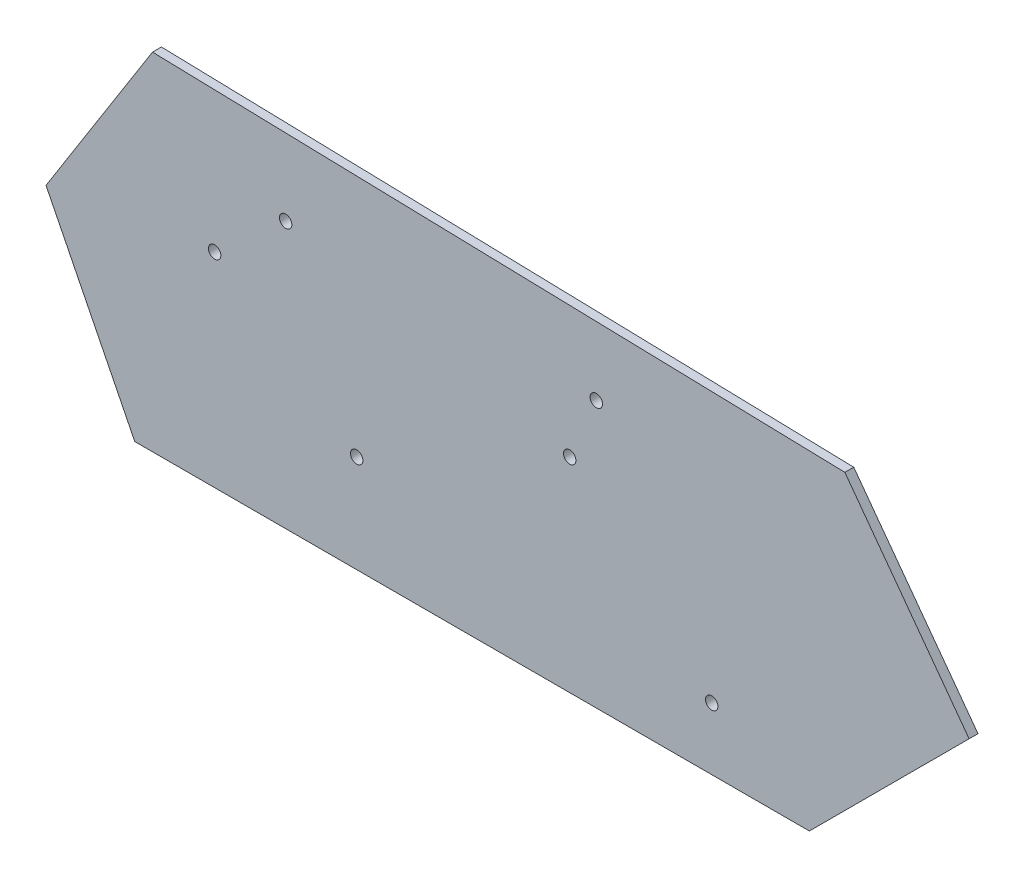
ISO-10303-21;
HEADER;
FILE_DESCRIPTION(('STEP AP214'),'2;1');
FILE_NAME('part.step','',(''),(''),'','','');
FILE_SCHEMA(('AUTOMOTIVE_DESIGN { 1 0 10303 214 1 1 1 1 }'));
ENDSEC;
DATA;
#1=APPLICATION_CONTEXT('core data for automotive mechanical design processes');
#2=APPLICATION_PROTOCOL_DEFINITION('international standard','automotive_design',2000,#1);
#3=PRODUCT_CONTEXT('',#1,'mechanical');
#4=PRODUCT('Part','Part','',(#3));
#5=PRODUCT_RELATED_PRODUCT_CATEGORY('part','',(#4));
#6=PRODUCT_DEFINITION_FORMATION('','',#4);
#7=PRODUCT_DEFINITION_CONTEXT('part definition',#1,'design');
#8=PRODUCT_DEFINITION('design','',#6,#7);
#9=PRODUCT_DEFINITION_SHAPE('','',#8);
#10=(LENGTH_UNIT() NAMED_UNIT(*) SI_UNIT(.MILLI.,.METRE.));
#11=(NAMED_UNIT(*) PLANE_ANGLE_UNIT() SI_UNIT($,.RADIAN.));
#12=(NAMED_UNIT(*) SI_UNIT($,.STERADIAN.) SOLID_ANGLE_UNIT());
#13=UNCERTAINTY_MEASURE_WITH_UNIT(LENGTH_MEASURE(1.E-05),#10,'distance_accuracy_value','');
#14=(GEOMETRIC_REPRESENTATION_CONTEXT(3) GLOBAL_UNCERTAINTY_ASSIGNED_CONTEXT((#13)) GLOBAL_UNIT_ASSIGNED_CONTEXT((#10,
#11,#12)) REPRESENTATION_CONTEXT('',''));
#15=CARTESIAN_POINT('',(0.,0.,0.));
#16=DIRECTION('',(0.,0.,1.));
#17=DIRECTION('',(1.,0.,0.));
#18=AXIS2_PLACEMENT_3D('',#15,#16,#17);
#19=CARTESIAN_POINT('',(0.,0.,5.));
#20=DIRECTION('',(0.,0.,-1.));
#21=DIRECTION('',(-1.,0.,0.));
#22=AXIS2_PLACEMENT_3D('',#19,#20,#21);
#23=PLANE('',#22);
#24=DIRECTION('',(-0.533992991387982,-0.845488903030971,0.));
#25=VECTOR('',#24,1.);
#26=CARTESIAN_POINT('',(-115.,140.,5.));
#27=LINE('',#26,#25);
#28=CARTESIAN_POINT('',(-115.,140.,5.));
#29=VERTEX_POINT('',#28);
#30=CARTESIAN_POINT('',(-175.,45.,5.));
#31=VERTEX_POINT('',#30);
#32=EDGE_CURVE('E137',#29,#31,#27,.T.);
#33=ORIENTED_EDGE('',*,*,#32,.T.);
#34=DIRECTION('',(0.447213595499958,-0.894427190999916,0.));
#35=VECTOR('',#34,1.);
#36=CARTESIAN_POINT('',(-175.,45.,5.));
#37=LINE('',#36,#35);
#38=CARTESIAN_POINT('',(-125.,-55.,5.));
#39=VERTEX_POINT('',#38);
#40=EDGE_CURVE('E92',#31,#39,#37,.T.);
#41=ORIENTED_EDGE('',*,*,#40,.T.);
#42=DIRECTION('',(1.,0.,0.));
#43=VECTOR('',#42,1.);
#44=CARTESIAN_POINT('',(-125.,-55.,5.));
#45=LINE('',#44,#43);
#46=CARTESIAN_POINT('',(255.,-55.,5.));
#47=VERTEX_POINT('',#46);
#48=EDGE_CURVE('E107',#39,#47,#45,.T.);
#49=ORIENTED_EDGE('',*,*,#48,.T.);
#50=DIRECTION('',(0.707106781186546,0.707106781186549,0.));
#51=VECTOR('',#50,1.);
#52=CARTESIAN_POINT('',(255.,-55.,5.));
#53=LINE('',#52,#51);
#54=CARTESIAN_POINT('',(345.,35.0000000000002,5.));
#55=VERTEX_POINT('',#54);
#56=EDGE_CURVE('E105',#47,#55,#53,.T.);
#57=ORIENTED_EDGE('',*,*,#56,.T.);
#58=DIRECTION('',(-0.59319903804985,0.805055837353368,0.));
#59=VECTOR('',#58,1.);
#60=CARTESIAN_POINT('',(345.,35.0000000000002,5.));
#61=LINE('',#60,#59);
#62=CARTESIAN_POINT('',(275.,130.,5.));
#63=VERTEX_POINT('',#62);
#64=EDGE_CURVE('E106',#55,#63,#61,.T.);
#65=ORIENTED_EDGE('',*,*,#64,.T.);
#66=DIRECTION('',(-0.999671430909481,0.0256326007925508,0.));
#67=VECTOR('',#66,1.);
#68=CARTESIAN_POINT('',(275.,130.,5.));
#69=LINE('',#68,#67);
#70=EDGE_CURVE('E59',#63,#29,#69,.T.);
#71=ORIENTED_EDGE('',*,*,#70,.T.);
#72=EDGE_LOOP('',(#33,#41,#49,#57,#65,#71));
#73=FACE_BOUND('',#72,.T.);
#74=CARTESIAN_POINT('',(0.,0.,5.));
#75=DIRECTION('',(0.,0.,1.));
#76=DIRECTION('',(1.,0.,0.));
#77=AXIS2_PLACEMENT_3D('',#74,#75,#76);
#78=CIRCLE('',#77,3.5);
#79=CARTESIAN_POINT('',(3.5,0.,5.));
#80=VERTEX_POINT('',#79);
#81=EDGE_CURVE('E128',#80,#80,#78,.T.);
#82=ORIENTED_EDGE('',*,*,#81,.F.);
#83=EDGE_LOOP('',(#82));
#84=FACE_BOUND('',#83,.T.);
#85=CARTESIAN_POINT('',(-80.,60.,5.));
#86=DIRECTION('',(0.,0.,1.));
#87=DIRECTION('',(1.,0.,0.));
#88=AXIS2_PLACEMENT_3D('',#85,#86,#87);
#89=CIRCLE('',#88,3.50000000000001);
#90=CARTESIAN_POINT('',(-76.5,60.,5.));
#91=VERTEX_POINT('',#90);
#92=EDGE_CURVE('E222',#91,#91,#89,.T.);
#93=ORIENTED_EDGE('',*,*,#92,.F.);
#94=EDGE_LOOP('',(#93));
#95=FACE_BOUND('',#94,.T.);
#96=CARTESIAN_POINT('',(120.,60.,5.));
#97=DIRECTION('',(0.,0.,1.));
#98=DIRECTION('',(1.,0.,0.));
#99=AXIS2_PLACEMENT_3D('',#96,#97,#98);
#100=CIRCLE('',#99,3.50000000000001);
#101=CARTESIAN_POINT('',(123.5,60.,5.));
#102=VERTEX_POINT('',#101);
#103=EDGE_CURVE('E214',#102,#102,#100,.T.);
#104=ORIENTED_EDGE('',*,*,#103,.F.);
#105=EDGE_LOOP('',(#104));
#106=FACE_BOUND('',#105,.T.);
#107=CARTESIAN_POINT('',(200.,-20.,5.));
#108=DIRECTION('',(0.,0.,1.));
#109=DIRECTION('',(1.,0.,0.));
#110=AXIS2_PLACEMENT_3D('',#107,#108,#109);
#111=CIRCLE('',#110,3.49999999999999);
#112=CARTESIAN_POINT('',(203.5,-20.,5.));
#113=VERTEX_POINT('',#112);
#114=EDGE_CURVE('E207',#113,#113,#111,.T.);
#115=ORIENTED_EDGE('',*,*,#114,.F.);
#116=EDGE_LOOP('',(#115));
#117=FACE_BOUND('',#116,.T.);
#118=CARTESIAN_POINT('',(-40.,95.,5.));
#119=DIRECTION('',(0.,0.,1.));
#120=DIRECTION('',(1.,0.,0.));
#121=AXIS2_PLACEMENT_3D('',#118,#119,#120);
#122=CIRCLE('',#121,3.5);
#123=CARTESIAN_POINT('',(-36.5,95.,5.));
#124=VERTEX_POINT('',#123);
#125=EDGE_CURVE('E201',#124,#124,#122,.T.);
#126=ORIENTED_EDGE('',*,*,#125,.F.);
#127=EDGE_LOOP('',(#126));
#128=FACE_BOUND('',#127,.T.);
#129=CARTESIAN_POINT('',(135.,95.,5.));
#130=DIRECTION('',(0.,0.,1.));
#131=DIRECTION('',(1.,0.,0.));
#132=AXIS2_PLACEMENT_3D('',#129,#130,#131);
#133=CIRCLE('',#132,3.49999999999999);
#134=CARTESIAN_POINT('',(138.5,95.,5.));
#135=VERTEX_POINT('',#134);
#136=EDGE_CURVE('E193',#135,#135,#133,.T.);
#137=ORIENTED_EDGE('',*,*,#136,.F.);
#138=EDGE_LOOP('',(#137));
#139=FACE_BOUND('',#138,.T.);
#140=ADVANCED_FACE('F41',(#73,#84,#95,#106,#117,#128,#139),#23,.F.);
#141=CARTESIAN_POINT('',(0.,0.,0.));
#142=DIRECTION('',(0.,0.,-1.));
#143=DIRECTION('',(-1.,0.,0.));
#144=AXIS2_PLACEMENT_3D('',#141,#142,#143);
#145=PLANE('',#144);
#146=CARTESIAN_POINT('',(-40.,95.,0.));
#147=DIRECTION('',(0.,0.,1.));
#148=DIRECTION('',(1.,0.,0.));
#149=AXIS2_PLACEMENT_3D('',#146,#147,#148);
#150=CIRCLE('',#149,3.5);
#151=CARTESIAN_POINT('',(-36.5,95.,0.));
#152=VERTEX_POINT('',#151);
#153=EDGE_CURVE('E199',#152,#152,#150,.T.);
#154=ORIENTED_EDGE('',*,*,#153,.T.);
#155=EDGE_LOOP('',(#154));
#156=FACE_BOUND('',#155,.T.);
#157=CARTESIAN_POINT('',(120.,60.,0.));
#158=DIRECTION('',(0.,0.,1.));
#159=DIRECTION('',(1.,0.,0.));
#160=AXIS2_PLACEMENT_3D('',#157,#158,#159);
#161=CIRCLE('',#160,3.50000000000001);
#162=CARTESIAN_POINT('',(123.5,60.,0.));
#163=VERTEX_POINT('',#162);
#164=EDGE_CURVE('E215',#163,#163,#161,.T.);
#165=ORIENTED_EDGE('',*,*,#164,.T.);
#166=EDGE_LOOP('',(#165));
#167=FACE_BOUND('',#166,.T.);
#168=CARTESIAN_POINT('',(0.,0.,0.));
#169=DIRECTION('',(0.,0.,1.));
#170=DIRECTION('',(1.,0.,0.));
#171=AXIS2_PLACEMENT_3D('',#168,#169,#170);
#172=CIRCLE('',#171,3.5);
#173=CARTESIAN_POINT('',(3.5,0.,0.));
#174=VERTEX_POINT('',#173);
#175=EDGE_CURVE('E221',#174,#174,#172,.T.);
#176=ORIENTED_EDGE('',*,*,#175,.T.);
#177=EDGE_LOOP('',(#176));
#178=FACE_BOUND('',#177,.T.);
#179=DIRECTION('',(-0.533992991387982,-0.845488903030971,0.));
#180=VECTOR('',#179,1.);
#181=CARTESIAN_POINT('',(-115.,140.,0.));
#182=LINE('',#181,#180);
#183=CARTESIAN_POINT('',(-115.,140.,0.));
#184=VERTEX_POINT('',#183);
#185=CARTESIAN_POINT('',(-175.,45.,0.));
#186=VERTEX_POINT('',#185);
#187=EDGE_CURVE('E127',#184,#186,#182,.T.);
#188=ORIENTED_EDGE('',*,*,#187,.F.);
#189=DIRECTION('',(-0.999671430909481,0.0256326007925508,0.));
#190=VECTOR('',#189,1.);
#191=CARTESIAN_POINT('',(275.,130.,0.));
#192=LINE('',#191,#190);
#193=CARTESIAN_POINT('',(275.,130.,0.));
#194=VERTEX_POINT('',#193);
#195=EDGE_CURVE('E87',#194,#184,#192,.T.);
#196=ORIENTED_EDGE('',*,*,#195,.F.);
#197=DIRECTION('',(-0.59319903804985,0.805055837353368,0.));
#198=VECTOR('',#197,1.);
#199=CARTESIAN_POINT('',(345.,35.0000000000002,0.));
#200=LINE('',#199,#198);
#201=CARTESIAN_POINT('',(345.,35.0000000000002,0.));
#202=VERTEX_POINT('',#201);
#203=EDGE_CURVE('E81',#202,#194,#200,.T.);
#204=ORIENTED_EDGE('',*,*,#203,.F.);
#205=DIRECTION('',(0.707106781186546,0.707106781186549,0.));
#206=VECTOR('',#205,1.);
#207=CARTESIAN_POINT('',(255.,-55.,0.));
#208=LINE('',#207,#206);
#209=CARTESIAN_POINT('',(255.,-55.,0.));
#210=VERTEX_POINT('',#209);
#211=EDGE_CURVE('E118',#210,#202,#208,.T.);
#212=ORIENTED_EDGE('',*,*,#211,.F.);
#213=DIRECTION('',(1.,0.,0.));
#214=VECTOR('',#213,1.);
#215=CARTESIAN_POINT('',(-125.,-55.,0.));
#216=LINE('',#215,#214);
#217=CARTESIAN_POINT('',(-125.,-55.,0.));
#218=VERTEX_POINT('',#217);
#219=EDGE_CURVE('E134',#218,#210,#216,.T.);
#220=ORIENTED_EDGE('',*,*,#219,.F.);
#221=DIRECTION('',(0.447213595499958,-0.894427190999916,0.));
#222=VECTOR('',#221,1.);
#223=CARTESIAN_POINT('',(-175.,45.,0.));
#224=LINE('',#223,#222);
#225=EDGE_CURVE('E129',#186,#218,#224,.T.);
#226=ORIENTED_EDGE('',*,*,#225,.F.);
#227=EDGE_LOOP('',(#188,#196,#204,#212,#220,#226));
#228=FACE_BOUND('',#227,.T.);
#229=CARTESIAN_POINT('',(-80.,60.,0.));
#230=DIRECTION('',(0.,0.,1.));
#231=DIRECTION('',(1.,0.,0.));
#232=AXIS2_PLACEMENT_3D('',#229,#230,#231);
#233=CIRCLE('',#232,3.50000000000001);
#234=CARTESIAN_POINT('',(-76.5,60.,0.));
#235=VERTEX_POINT('',#234);
#236=EDGE_CURVE('E217',#235,#235,#233,.T.);
#237=ORIENTED_EDGE('',*,*,#236,.T.);
#238=EDGE_LOOP('',(#237));
#239=FACE_BOUND('',#238,.T.);
#240=CARTESIAN_POINT('',(200.,-20.,0.));
#241=DIRECTION('',(0.,0.,1.));
#242=DIRECTION('',(1.,0.,0.));
#243=AXIS2_PLACEMENT_3D('',#240,#241,#242);
#244=CIRCLE('',#243,3.49999999999999);
#245=CARTESIAN_POINT('',(203.5,-20.,0.));
#246=VERTEX_POINT('',#245);
#247=EDGE_CURVE('E206',#246,#246,#244,.T.);
#248=ORIENTED_EDGE('',*,*,#247,.T.);
#249=EDGE_LOOP('',(#248));
#250=FACE_BOUND('',#249,.T.);
#251=CARTESIAN_POINT('',(135.,95.,0.));
#252=DIRECTION('',(0.,0.,1.));
#253=DIRECTION('',(1.,0.,0.));
#254=AXIS2_PLACEMENT_3D('',#251,#252,#253);
#255=CIRCLE('',#254,3.49999999999999);
#256=CARTESIAN_POINT('',(138.5,95.,0.));
#257=VERTEX_POINT('',#256);
#258=EDGE_CURVE('E197',#257,#257,#255,.T.);
#259=ORIENTED_EDGE('',*,*,#258,.T.);
#260=EDGE_LOOP('',(#259));
#261=FACE_BOUND('',#260,.T.);
#262=ADVANCED_FACE('F148',(#156,#167,#178,#228,#239,#250,#261),#145,.T.);
#263=CARTESIAN_POINT('',(-115.,140.,5.));
#264=DIRECTION('',(0.845488903030971,-0.533992991387982,0.));
#265=DIRECTION('',(0.533992991387982,0.845488903030971,0.));
#266=AXIS2_PLACEMENT_3D('',#263,#264,#265);
#267=PLANE('',#266);
#268=ORIENTED_EDGE('',*,*,#187,.T.);
#269=DIRECTION('',(0.,0.,-1.));
#270=VECTOR('',#269,1.);
#271=CARTESIAN_POINT('',(-175.,45.,5.));
#272=LINE('',#271,#270);
#273=EDGE_CURVE('E11',#31,#186,#272,.T.);
#274=ORIENTED_EDGE('',*,*,#273,.F.);
#275=ORIENTED_EDGE('',*,*,#32,.F.);
#276=DIRECTION('',(0.,0.,-1.));
#277=VECTOR('',#276,1.);
#278=CARTESIAN_POINT('',(-115.,140.,5.));
#279=LINE('',#278,#277);
#280=EDGE_CURVE('E122',#29,#184,#279,.T.);
#281=ORIENTED_EDGE('',*,*,#280,.T.);
#282=EDGE_LOOP('',(#268,#274,#275,#281));
#283=FACE_BOUND('',#282,.T.);
#284=ADVANCED_FACE('F43',(#283),#267,.F.);
#285=CARTESIAN_POINT('',(-175.,45.,5.));
#286=DIRECTION('',(0.894427190999916,0.447213595499958,0.));
#287=DIRECTION('',(-0.447213595499958,0.894427190999916,0.));
#288=AXIS2_PLACEMENT_3D('',#285,#286,#287);
#289=PLANE('',#288);
#290=ORIENTED_EDGE('',*,*,#225,.T.);
#291=DIRECTION('',(0.,0.,-1.));
#292=VECTOR('',#291,1.);
#293=CARTESIAN_POINT('',(-125.,-55.,5.));
#294=LINE('',#293,#292);
#295=EDGE_CURVE('E49',#39,#218,#294,.T.);
#296=ORIENTED_EDGE('',*,*,#295,.F.);
#297=ORIENTED_EDGE('',*,*,#40,.F.);
#298=ORIENTED_EDGE('',*,*,#273,.T.);
#299=EDGE_LOOP('',(#290,#296,#297,#298));
#300=FACE_BOUND('',#299,.T.);
#301=ADVANCED_FACE('F306',(#300),#289,.F.);
#302=CARTESIAN_POINT('',(-125.,-55.,5.));
#303=DIRECTION('',(0.,1.,0.));
#304=DIRECTION('',(0.,0.,1.));
#305=AXIS2_PLACEMENT_3D('',#302,#303,#304);
#306=PLANE('',#305);
#307=ORIENTED_EDGE('',*,*,#219,.T.);
#308=DIRECTION('',(0.,0.,-1.));
#309=VECTOR('',#308,1.);
#310=CARTESIAN_POINT('',(255.,-55.,5.));
#311=LINE('',#310,#309);
#312=EDGE_CURVE('E119',#47,#210,#311,.T.);
#313=ORIENTED_EDGE('',*,*,#312,.F.);
#314=ORIENTED_EDGE('',*,*,#48,.F.);
#315=ORIENTED_EDGE('',*,*,#295,.T.);
#316=EDGE_LOOP('',(#307,#313,#314,#315));
#317=FACE_BOUND('',#316,.T.);
#318=ADVANCED_FACE('F141',(#317),#306,.F.);
#319=CARTESIAN_POINT('',(255.,-55.,5.));
#320=DIRECTION('',(-0.707106781186549,0.707106781186546,0.));
#321=DIRECTION('',(-0.707106781186546,-0.707106781186549,0.));
#322=AXIS2_PLACEMENT_3D('',#319,#320,#321);
#323=PLANE('',#322);
#324=ORIENTED_EDGE('',*,*,#211,.T.);
#325=DIRECTION('',(0.,0.,-1.));
#326=VECTOR('',#325,1.);
#327=CARTESIAN_POINT('',(345.,35.0000000000002,5.));
#328=LINE('',#327,#326);
#329=EDGE_CURVE('E114',#55,#202,#328,.T.);
#330=ORIENTED_EDGE('',*,*,#329,.F.);
#331=ORIENTED_EDGE('',*,*,#56,.F.);
#332=ORIENTED_EDGE('',*,*,#312,.T.);
#333=EDGE_LOOP('',(#324,#330,#331,#332));
#334=FACE_BOUND('',#333,.T.);
#335=ADVANCED_FACE('F111',(#334),#323,.F.);
#336=CARTESIAN_POINT('',(345.,35.0000000000002,5.));
#337=DIRECTION('',(-0.805055837353368,-0.59319903804985,0.));
#338=DIRECTION('',(0.59319903804985,-0.805055837353368,0.));
#339=AXIS2_PLACEMENT_3D('',#336,#337,#338);
#340=PLANE('',#339);
#341=ORIENTED_EDGE('',*,*,#203,.T.);
#342=DIRECTION('',(0.,0.,-1.));
#343=VECTOR('',#342,1.);
#344=CARTESIAN_POINT('',(275.,130.,5.));
#345=LINE('',#344,#343);
#346=EDGE_CURVE('E117',#63,#194,#345,.T.);
#347=ORIENTED_EDGE('',*,*,#346,.F.);
#348=ORIENTED_EDGE('',*,*,#64,.F.);
#349=ORIENTED_EDGE('',*,*,#329,.T.);
#350=EDGE_LOOP('',(#341,#347,#348,#349));
#351=FACE_BOUND('',#350,.T.);
#352=ADVANCED_FACE('F116',(#351),#340,.F.);
#353=CARTESIAN_POINT('',(275.,130.,5.));
#354=DIRECTION('',(-0.0256326007925508,-0.999671430909481,0.));
#355=DIRECTION('',(0.999671430909481,-0.0256326007925508,0.));
#356=AXIS2_PLACEMENT_3D('',#353,#354,#355);
#357=PLANE('',#356);
#358=ORIENTED_EDGE('',*,*,#195,.T.);
#359=ORIENTED_EDGE('',*,*,#280,.F.);
#360=ORIENTED_EDGE('',*,*,#70,.F.);
#361=ORIENTED_EDGE('',*,*,#346,.T.);
#362=EDGE_LOOP('',(#358,#359,#360,#361));
#363=FACE_BOUND('',#362,.T.);
#364=ADVANCED_FACE('F151',(#363),#357,.F.);
#365=CARTESIAN_POINT('',(0.,0.,5.));
#366=DIRECTION('',(0.,0.,-1.));
#367=DIRECTION('',(-1.,0.,0.));
#368=AXIS2_PLACEMENT_3D('',#365,#366,#367);
#369=CYLINDRICAL_SURFACE('',#368,3.5);
#370=ORIENTED_EDGE('',*,*,#81,.T.);
#371=EDGE_LOOP('',(#370));
#372=FACE_BOUND('',#371,.T.);
#373=ORIENTED_EDGE('',*,*,#175,.F.);
#374=EDGE_LOOP('',(#373));
#375=FACE_BOUND('',#374,.T.);
#376=ADVANCED_FACE('F153',(#372,#375),#369,.F.);
#377=CARTESIAN_POINT('',(-80.,60.,5.));
#378=DIRECTION('',(0.,0.,-1.));
#379=DIRECTION('',(-1.,0.,0.));
#380=AXIS2_PLACEMENT_3D('',#377,#378,#379);
#381=CYLINDRICAL_SURFACE('',#380,3.50000000000001);
#382=ORIENTED_EDGE('',*,*,#92,.T.);
#383=EDGE_LOOP('',(#382));
#384=FACE_BOUND('',#383,.T.);
#385=ORIENTED_EDGE('',*,*,#236,.F.);
#386=EDGE_LOOP('',(#385));
#387=FACE_BOUND('',#386,.T.);
#388=ADVANCED_FACE('F157',(#384,#387),#381,.F.);
#389=CARTESIAN_POINT('',(120.,60.,5.));
#390=DIRECTION('',(0.,0.,-1.));
#391=DIRECTION('',(-1.,0.,0.));
#392=AXIS2_PLACEMENT_3D('',#389,#390,#391);
#393=CYLINDRICAL_SURFACE('',#392,3.50000000000001);
#394=ORIENTED_EDGE('',*,*,#103,.T.);
#395=EDGE_LOOP('',(#394));
#396=FACE_BOUND('',#395,.T.);
#397=ORIENTED_EDGE('',*,*,#164,.F.);
#398=EDGE_LOOP('',(#397));
#399=FACE_BOUND('',#398,.T.);
#400=ADVANCED_FACE('F172',(#396,#399),#393,.F.);
#401=CARTESIAN_POINT('',(200.,-20.,5.));
#402=DIRECTION('',(0.,0.,-1.));
#403=DIRECTION('',(-1.,0.,0.));
#404=AXIS2_PLACEMENT_3D('',#401,#402,#403);
#405=CYLINDRICAL_SURFACE('',#404,3.49999999999999);
#406=ORIENTED_EDGE('',*,*,#114,.T.);
#407=EDGE_LOOP('',(#406));
#408=FACE_BOUND('',#407,.T.);
#409=ORIENTED_EDGE('',*,*,#247,.F.);
#410=EDGE_LOOP('',(#409));
#411=FACE_BOUND('',#410,.T.);
#412=ADVANCED_FACE('F177',(#408,#411),#405,.F.);
#413=CARTESIAN_POINT('',(-40.,95.,5.));
#414=DIRECTION('',(0.,0.,-1.));
#415=DIRECTION('',(-1.,0.,0.));
#416=AXIS2_PLACEMENT_3D('',#413,#414,#415);
#417=CYLINDRICAL_SURFACE('',#416,3.5);
#418=ORIENTED_EDGE('',*,*,#125,.T.);
#419=EDGE_LOOP('',(#418));
#420=FACE_BOUND('',#419,.T.);
#421=ORIENTED_EDGE('',*,*,#153,.F.);
#422=EDGE_LOOP('',(#421));
#423=FACE_BOUND('',#422,.T.);
#424=ADVANCED_FACE('F182',(#420,#423),#417,.F.);
#425=CARTESIAN_POINT('',(135.,95.,5.));
#426=DIRECTION('',(0.,0.,-1.));
#427=DIRECTION('',(-1.,0.,0.));
#428=AXIS2_PLACEMENT_3D('',#425,#426,#427);
#429=CYLINDRICAL_SURFACE('',#428,3.49999999999999);
#430=ORIENTED_EDGE('',*,*,#136,.T.);
#431=EDGE_LOOP('',(#430));
#432=FACE_BOUND('',#431,.T.);
#433=ORIENTED_EDGE('',*,*,#258,.F.);
#434=EDGE_LOOP('',(#433));
#435=FACE_BOUND('',#434,.T.);
#436=ADVANCED_FACE('F183',(#432,#435),#429,.F.);
#437=CLOSED_SHELL('',(#140,#262,#284,#301,#318,#335,#352,#364,#376,#388,#400,#412,#424,#436));
#438=MANIFOLD_SOLID_BREP('B2',#437);
#439=ADVANCED_BREP_SHAPE_REPRESENTATION('',(#18,#438),#14);
#440=SHAPE_DEFINITION_REPRESENTATION(#9,#439);
ENDSEC;
END-ISO-10303-21;
